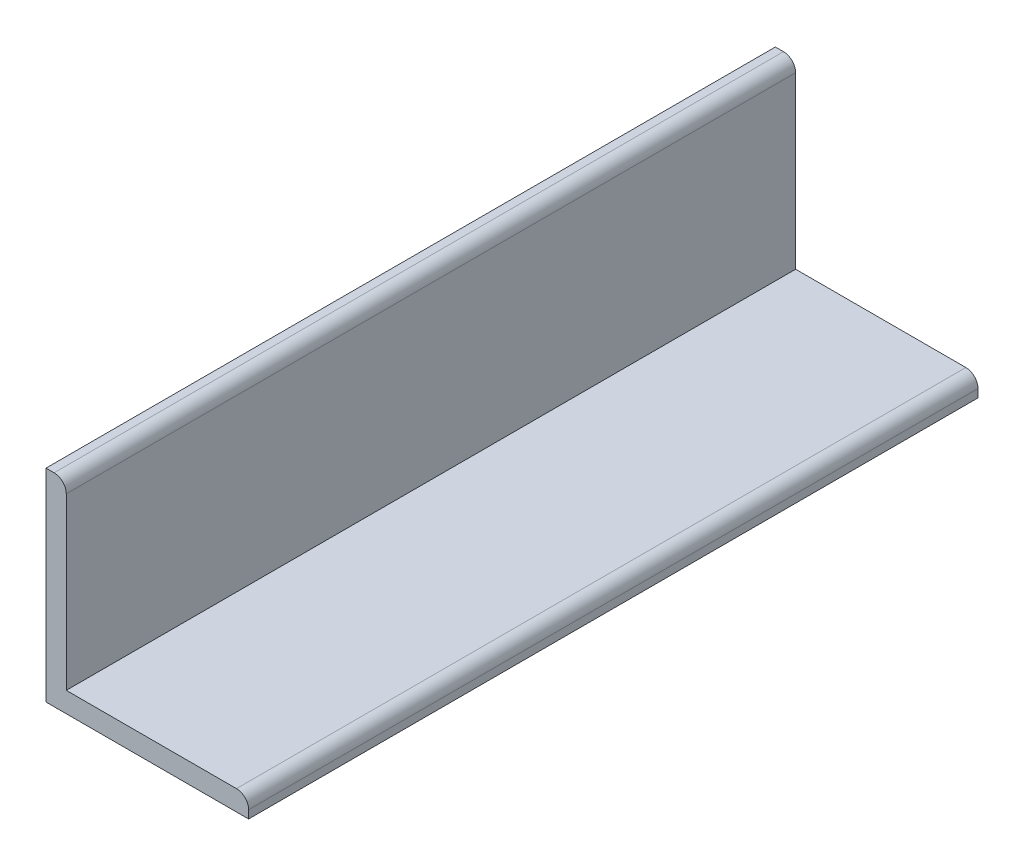
ISO-10303-21;
HEADER;
FILE_DESCRIPTION(('STEP AP214'),'2;1');
FILE_NAME('part.step','',(''),(''),'','','');
FILE_SCHEMA(('AUTOMOTIVE_DESIGN { 1 0 10303 214 1 1 1 1 }'));
ENDSEC;
DATA;
#1=APPLICATION_CONTEXT('core data for automotive mechanical design processes');
#2=APPLICATION_PROTOCOL_DEFINITION('international standard','automotive_design',2000,#1);
#3=PRODUCT_CONTEXT('',#1,'mechanical');
#4=PRODUCT('Part','Part','',(#3));
#5=PRODUCT_RELATED_PRODUCT_CATEGORY('part','',(#4));
#6=PRODUCT_DEFINITION_FORMATION('','',#4);
#7=PRODUCT_DEFINITION_CONTEXT('part definition',#1,'design');
#8=PRODUCT_DEFINITION('design','',#6,#7);
#9=PRODUCT_DEFINITION_SHAPE('','',#8);
#10=(LENGTH_UNIT() NAMED_UNIT(*) SI_UNIT(.MILLI.,.METRE.));
#11=(NAMED_UNIT(*) PLANE_ANGLE_UNIT() SI_UNIT($,.RADIAN.));
#12=(NAMED_UNIT(*) SI_UNIT($,.STERADIAN.) SOLID_ANGLE_UNIT());
#13=UNCERTAINTY_MEASURE_WITH_UNIT(LENGTH_MEASURE(1.E-05),#10,'distance_accuracy_value','');
#14=(GEOMETRIC_REPRESENTATION_CONTEXT(3) GLOBAL_UNCERTAINTY_ASSIGNED_CONTEXT((#13)) GLOBAL_UNIT_ASSIGNED_CONTEXT((#10,
#11,#12)) REPRESENTATION_CONTEXT('',''));
#15=CARTESIAN_POINT('',(0.,0.,0.));
#16=DIRECTION('',(0.,0.,1.));
#17=DIRECTION('',(1.,0.,0.));
#18=AXIS2_PLACEMENT_3D('',#15,#16,#17);
#19=CARTESIAN_POINT('',(-25.,-25.,90.));
#20=DIRECTION('',(1.,0.,0.));
#21=DIRECTION('',(0.,0.,-1.));
#22=AXIS2_PLACEMENT_3D('',#19,#20,#21);
#23=PLANE('',#22);
#24=DIRECTION('',(0.,-1.,0.));
#25=VECTOR('',#24,1.);
#26=CARTESIAN_POINT('',(-25.,-25.,-90.));
#27=LINE('',#26,#25);
#28=CARTESIAN_POINT('',(-25.,25.,-90.));
#29=VERTEX_POINT('',#28);
#30=CARTESIAN_POINT('',(-25.,-25.,-90.));
#31=VERTEX_POINT('',#30);
#32=EDGE_CURVE('E140',#29,#31,#27,.T.);
#33=ORIENTED_EDGE('',*,*,#32,.T.);
#34=DIRECTION('',(0.,0.,-1.));
#35=VECTOR('',#34,1.);
#36=CARTESIAN_POINT('',(-25.,-25.,90.));
#37=LINE('',#36,#35);
#38=CARTESIAN_POINT('',(-25.,-25.,90.));
#39=VERTEX_POINT('',#38);
#40=EDGE_CURVE('E11',#39,#31,#37,.T.);
#41=ORIENTED_EDGE('',*,*,#40,.F.);
#42=DIRECTION('',(0.,-1.,0.));
#43=VECTOR('',#42,1.);
#44=CARTESIAN_POINT('',(-25.,-25.,90.));
#45=LINE('',#44,#43);
#46=CARTESIAN_POINT('',(-25.,25.,90.));
#47=VERTEX_POINT('',#46);
#48=EDGE_CURVE('E162',#47,#39,#45,.T.);
#49=ORIENTED_EDGE('',*,*,#48,.F.);
#50=DIRECTION('',(0.,0.,-1.));
#51=VECTOR('',#50,1.);
#52=CARTESIAN_POINT('',(-25.,25.,90.));
#53=LINE('',#52,#51);
#54=EDGE_CURVE('E136',#47,#29,#53,.T.);
#55=ORIENTED_EDGE('',*,*,#54,.T.);
#56=EDGE_LOOP('',(#33,#41,#49,#55));
#57=FACE_BOUND('',#56,.T.);
#58=ADVANCED_FACE('F39',(#57),#23,.F.);
#59=CARTESIAN_POINT('',(-25.,-25.,90.));
#60=DIRECTION('',(0.,1.,0.));
#61=DIRECTION('',(0.,0.,1.));
#62=AXIS2_PLACEMENT_3D('',#59,#60,#61);
#63=PLANE('',#62);
#64=DIRECTION('',(1.,0.,0.));
#65=VECTOR('',#64,1.);
#66=CARTESIAN_POINT('',(-25.,-25.,-90.));
#67=LINE('',#66,#65);
#68=CARTESIAN_POINT('',(25.,-25.,-90.));
#69=VERTEX_POINT('',#68);
#70=EDGE_CURVE('E144',#31,#69,#67,.T.);
#71=ORIENTED_EDGE('',*,*,#70,.T.);
#72=DIRECTION('',(0.,0.,-1.));
#73=VECTOR('',#72,1.);
#74=CARTESIAN_POINT('',(25.,-25.,90.));
#75=LINE('',#74,#73);
#76=CARTESIAN_POINT('',(25.,-25.,90.));
#77=VERTEX_POINT('',#76);
#78=EDGE_CURVE('E48',#77,#69,#75,.T.);
#79=ORIENTED_EDGE('',*,*,#78,.F.);
#80=DIRECTION('',(1.,0.,0.));
#81=VECTOR('',#80,1.);
#82=CARTESIAN_POINT('',(-25.,-25.,90.));
#83=LINE('',#82,#81);
#84=EDGE_CURVE('E99',#39,#77,#83,.T.);
#85=ORIENTED_EDGE('',*,*,#84,.F.);
#86=ORIENTED_EDGE('',*,*,#40,.T.);
#87=EDGE_LOOP('',(#71,#79,#85,#86));
#88=FACE_BOUND('',#87,.T.);
#89=ADVANCED_FACE('F208',(#88),#63,.F.);
#90=CARTESIAN_POINT('',(25.,-25.,90.));
#91=DIRECTION('',(-1.,0.,0.));
#92=DIRECTION('',(0.,-1.,0.));
#93=AXIS2_PLACEMENT_3D('',#90,#91,#92);
#94=PLANE('',#93);
#95=DIRECTION('',(0.,1.,0.));
#96=VECTOR('',#95,1.);
#97=CARTESIAN_POINT('',(25.,-25.,-90.));
#98=LINE('',#97,#96);
#99=CARTESIAN_POINT('',(25.,-23.,-90.));
#100=VERTEX_POINT('',#99);
#101=EDGE_CURVE('E147',#69,#100,#98,.T.);
#102=ORIENTED_EDGE('',*,*,#101,.T.);
#103=DIRECTION('',(0.,0.,-1.));
#104=VECTOR('',#103,1.);
#105=CARTESIAN_POINT('',(25.,-23.,90.));
#106=LINE('',#105,#104);
#107=CARTESIAN_POINT('',(25.,-23.,90.));
#108=VERTEX_POINT('',#107);
#109=EDGE_CURVE('E173',#108,#100,#106,.T.);
#110=ORIENTED_EDGE('',*,*,#109,.F.);
#111=DIRECTION('',(0.,1.,0.));
#112=VECTOR('',#111,1.);
#113=CARTESIAN_POINT('',(25.,-25.,90.));
#114=LINE('',#113,#112);
#115=EDGE_CURVE('E183',#77,#108,#114,.T.);
#116=ORIENTED_EDGE('',*,*,#115,.F.);
#117=ORIENTED_EDGE('',*,*,#78,.T.);
#118=EDGE_LOOP('',(#102,#110,#116,#117));
#119=FACE_BOUND('',#118,.T.);
#120=ADVANCED_FACE('F181',(#119),#94,.F.);
#121=CARTESIAN_POINT('',(22.,-23.,90.));
#122=DIRECTION('',(0.,0.,-1.));
#123=DIRECTION('',(-1.,0.,0.));
#124=AXIS2_PLACEMENT_3D('',#121,#122,#123);
#125=CYLINDRICAL_SURFACE('',#124,3.);
#126=CARTESIAN_POINT('',(22.,-23.,-90.));
#127=DIRECTION('',(0.,0.,1.));
#128=DIRECTION('',(-1.,0.,0.));
#129=AXIS2_PLACEMENT_3D('',#126,#127,#128);
#130=CIRCLE('',#129,3.);
#131=CARTESIAN_POINT('',(22.,-20.,-90.));
#132=VERTEX_POINT('',#131);
#133=EDGE_CURVE('E150',#100,#132,#130,.T.);
#134=ORIENTED_EDGE('',*,*,#133,.T.);
#135=DIRECTION('',(0.,0.,-1.));
#136=VECTOR('',#135,1.);
#137=CARTESIAN_POINT('',(22.,-20.,90.));
#138=LINE('',#137,#136);
#139=CARTESIAN_POINT('',(22.,-20.,90.));
#140=VERTEX_POINT('',#139);
#141=EDGE_CURVE('E169',#140,#132,#138,.T.);
#142=ORIENTED_EDGE('',*,*,#141,.F.);
#143=CARTESIAN_POINT('',(22.,-23.,90.));
#144=DIRECTION('',(0.,0.,1.));
#145=DIRECTION('',(-1.,0.,0.));
#146=AXIS2_PLACEMENT_3D('',#143,#144,#145);
#147=CIRCLE('',#146,3.);
#148=EDGE_CURVE('E196',#108,#140,#147,.T.);
#149=ORIENTED_EDGE('',*,*,#148,.F.);
#150=ORIENTED_EDGE('',*,*,#109,.T.);
#151=EDGE_LOOP('',(#134,#142,#149,#150));
#152=FACE_BOUND('',#151,.T.);
#153=ADVANCED_FACE('F191',(#152),#125,.T.);
#154=CARTESIAN_POINT('',(-20.,-20.,90.));
#155=DIRECTION('',(0.,-1.,0.));
#156=DIRECTION('',(1.,0.,0.));
#157=AXIS2_PLACEMENT_3D('',#154,#155,#156);
#158=PLANE('',#157);
#159=DIRECTION('',(-1.,0.,0.));
#160=VECTOR('',#159,1.);
#161=CARTESIAN_POINT('',(-20.,-20.,-90.));
#162=LINE('',#161,#160);
#163=CARTESIAN_POINT('',(-20.,-20.,-90.));
#164=VERTEX_POINT('',#163);
#165=EDGE_CURVE('E153',#132,#164,#162,.T.);
#166=ORIENTED_EDGE('',*,*,#165,.T.);
#167=DIRECTION('',(0.,0.,-1.));
#168=VECTOR('',#167,1.);
#169=CARTESIAN_POINT('',(-20.,-20.,90.));
#170=LINE('',#169,#168);
#171=CARTESIAN_POINT('',(-20.,-20.,90.));
#172=VERTEX_POINT('',#171);
#173=EDGE_CURVE('E129',#172,#164,#170,.T.);
#174=ORIENTED_EDGE('',*,*,#173,.F.);
#175=DIRECTION('',(-1.,0.,0.));
#176=VECTOR('',#175,1.);
#177=CARTESIAN_POINT('',(-20.,-20.,90.));
#178=LINE('',#177,#176);
#179=EDGE_CURVE('E118',#140,#172,#178,.T.);
#180=ORIENTED_EDGE('',*,*,#179,.F.);
#181=ORIENTED_EDGE('',*,*,#141,.T.);
#182=EDGE_LOOP('',(#166,#174,#180,#181));
#183=FACE_BOUND('',#182,.T.);
#184=ADVANCED_FACE('F194',(#183),#158,.F.);
#185=CARTESIAN_POINT('',(-20.,22.,90.));
#186=DIRECTION('',(-1.,0.,0.));
#187=DIRECTION('',(0.,-1.,0.));
#188=AXIS2_PLACEMENT_3D('',#185,#186,#187);
#189=PLANE('',#188);
#190=DIRECTION('',(0.,1.,0.));
#191=VECTOR('',#190,1.);
#192=CARTESIAN_POINT('',(-20.,22.,-90.));
#193=LINE('',#192,#191);
#194=CARTESIAN_POINT('',(-20.,22.,-90.));
#195=VERTEX_POINT('',#194);
#196=EDGE_CURVE('E127',#164,#195,#193,.T.);
#197=ORIENTED_EDGE('',*,*,#196,.T.);
#198=DIRECTION('',(0.,0.,-1.));
#199=VECTOR('',#198,1.);
#200=CARTESIAN_POINT('',(-20.,22.,90.));
#201=LINE('',#200,#199);
#202=CARTESIAN_POINT('',(-20.,22.,90.));
#203=VERTEX_POINT('',#202);
#204=EDGE_CURVE('E124',#203,#195,#201,.T.);
#205=ORIENTED_EDGE('',*,*,#204,.F.);
#206=DIRECTION('',(0.,1.,0.));
#207=VECTOR('',#206,1.);
#208=CARTESIAN_POINT('',(-20.,22.,90.));
#209=LINE('',#208,#207);
#210=EDGE_CURVE('E112',#172,#203,#209,.T.);
#211=ORIENTED_EDGE('',*,*,#210,.F.);
#212=ORIENTED_EDGE('',*,*,#173,.T.);
#213=EDGE_LOOP('',(#197,#205,#211,#212));
#214=FACE_BOUND('',#213,.T.);
#215=ADVANCED_FACE('F125',(#214),#189,.F.);
#216=CARTESIAN_POINT('',(-23.,22.,90.));
#217=DIRECTION('',(0.,0.,-1.));
#218=DIRECTION('',(-1.,0.,0.));
#219=AXIS2_PLACEMENT_3D('',#216,#217,#218);
#220=CYLINDRICAL_SURFACE('',#219,3.);
#221=CARTESIAN_POINT('',(-23.,22.,-90.));
#222=DIRECTION('',(0.,0.,1.));
#223=DIRECTION('',(1.,0.,0.));
#224=AXIS2_PLACEMENT_3D('',#221,#222,#223);
#225=CIRCLE('',#224,3.);
#226=CARTESIAN_POINT('',(-23.,25.,-90.));
#227=VERTEX_POINT('',#226);
#228=EDGE_CURVE('E85',#195,#227,#225,.T.);
#229=ORIENTED_EDGE('',*,*,#228,.T.);
#230=DIRECTION('',(0.,0.,-1.));
#231=VECTOR('',#230,1.);
#232=CARTESIAN_POINT('',(-23.,25.,90.));
#233=LINE('',#232,#231);
#234=CARTESIAN_POINT('',(-23.,25.,90.));
#235=VERTEX_POINT('',#234);
#236=EDGE_CURVE('E130',#235,#227,#233,.T.);
#237=ORIENTED_EDGE('',*,*,#236,.F.);
#238=CARTESIAN_POINT('',(-23.,22.,90.));
#239=DIRECTION('',(0.,0.,1.));
#240=DIRECTION('',(1.,0.,0.));
#241=AXIS2_PLACEMENT_3D('',#238,#239,#240);
#242=CIRCLE('',#241,3.);
#243=EDGE_CURVE('E116',#203,#235,#242,.T.);
#244=ORIENTED_EDGE('',*,*,#243,.F.);
#245=ORIENTED_EDGE('',*,*,#204,.T.);
#246=EDGE_LOOP('',(#229,#237,#244,#245));
#247=FACE_BOUND('',#246,.T.);
#248=ADVANCED_FACE('F132',(#247),#220,.T.);
#249=CARTESIAN_POINT('',(-25.,25.,90.));
#250=DIRECTION('',(0.,-1.,0.));
#251=DIRECTION('',(0.,0.,-1.));
#252=AXIS2_PLACEMENT_3D('',#249,#250,#251);
#253=PLANE('',#252);
#254=DIRECTION('',(-1.,0.,0.));
#255=VECTOR('',#254,1.);
#256=CARTESIAN_POINT('',(-25.,25.,-90.));
#257=LINE('',#256,#255);
#258=EDGE_CURVE('E91',#227,#29,#257,.T.);
#259=ORIENTED_EDGE('',*,*,#258,.T.);
#260=ORIENTED_EDGE('',*,*,#54,.F.);
#261=DIRECTION('',(-1.,0.,0.));
#262=VECTOR('',#261,1.);
#263=CARTESIAN_POINT('',(-25.,25.,90.));
#264=LINE('',#263,#262);
#265=EDGE_CURVE('E56',#235,#47,#264,.T.);
#266=ORIENTED_EDGE('',*,*,#265,.F.);
#267=ORIENTED_EDGE('',*,*,#236,.T.);
#268=EDGE_LOOP('',(#259,#260,#266,#267));
#269=FACE_BOUND('',#268,.T.);
#270=ADVANCED_FACE('F224',(#269),#253,.F.);
#271=CARTESIAN_POINT('',(-23.,22.,90.));
#272=DIRECTION('',(0.,0.,1.));
#273=DIRECTION('',(1.,0.,0.));
#274=AXIS2_PLACEMENT_3D('',#271,#272,#273);
#275=PLANE('',#274);
#276=ORIENTED_EDGE('',*,*,#48,.T.);
#277=ORIENTED_EDGE('',*,*,#84,.T.);
#278=ORIENTED_EDGE('',*,*,#115,.T.);
#279=ORIENTED_EDGE('',*,*,#148,.T.);
#280=ORIENTED_EDGE('',*,*,#179,.T.);
#281=ORIENTED_EDGE('',*,*,#210,.T.);
#282=ORIENTED_EDGE('',*,*,#243,.T.);
#283=ORIENTED_EDGE('',*,*,#265,.T.);
#284=EDGE_LOOP('',(#276,#277,#278,#279,#280,#281,#282,#283));
#285=FACE_BOUND('',#284,.T.);
#286=ADVANCED_FACE('F114',(#285),#275,.T.);
#287=CARTESIAN_POINT('',(-23.,22.,-90.));
#288=DIRECTION('',(0.,0.,1.));
#289=DIRECTION('',(1.,0.,0.));
#290=AXIS2_PLACEMENT_3D('',#287,#288,#289);
#291=PLANE('',#290);
#292=ORIENTED_EDGE('',*,*,#32,.F.);
#293=ORIENTED_EDGE('',*,*,#258,.F.);
#294=ORIENTED_EDGE('',*,*,#228,.F.);
#295=ORIENTED_EDGE('',*,*,#196,.F.);
#296=ORIENTED_EDGE('',*,*,#165,.F.);
#297=ORIENTED_EDGE('',*,*,#133,.F.);
#298=ORIENTED_EDGE('',*,*,#101,.F.);
#299=ORIENTED_EDGE('',*,*,#70,.F.);
#300=EDGE_LOOP('',(#292,#293,#294,#295,#296,#297,#298,#299));
#301=FACE_BOUND('',#300,.T.);
#302=ADVANCED_FACE('F187',(#301),#291,.F.);
#303=CLOSED_SHELL('',(#58,#89,#120,#153,#184,#215,#248,#270,#286,#302));
#304=MANIFOLD_SOLID_BREP('B2',#303);
#305=ADVANCED_BREP_SHAPE_REPRESENTATION('',(#18,#304),#14);
#306=SHAPE_DEFINITION_REPRESENTATION(#9,#305);
ENDSEC;
END-ISO-10303-21;
